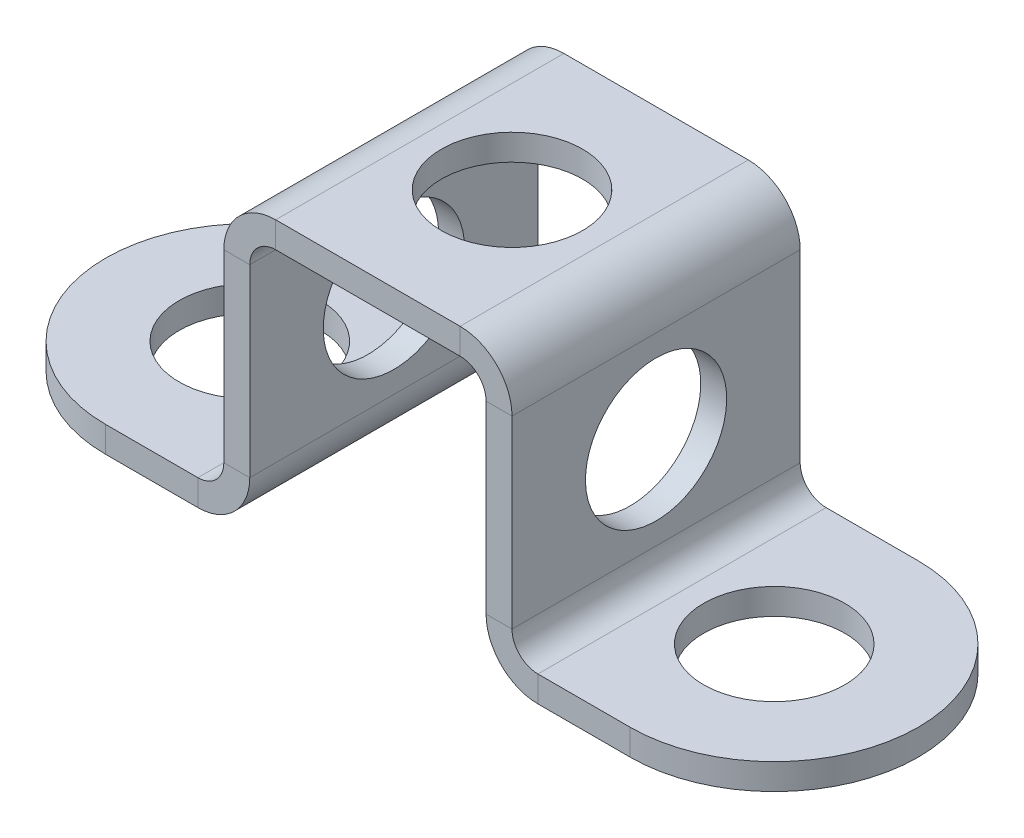
ISO-10303-21;
HEADER;
FILE_DESCRIPTION(('STEP AP214'),'2;1');
FILE_NAME('part.step','',(''),(''),'','','');
FILE_SCHEMA(('AUTOMOTIVE_DESIGN { 1 0 10303 214 1 1 1 1 }'));
ENDSEC;
DATA;
#1=APPLICATION_CONTEXT('core data for automotive mechanical design processes');
#2=APPLICATION_PROTOCOL_DEFINITION('international standard','automotive_design',2000,#1);
#3=PRODUCT_CONTEXT('',#1,'mechanical');
#4=PRODUCT('Part','Part','',(#3));
#5=PRODUCT_RELATED_PRODUCT_CATEGORY('part','',(#4));
#6=PRODUCT_DEFINITION_FORMATION('','',#4);
#7=PRODUCT_DEFINITION_CONTEXT('part definition',#1,'design');
#8=PRODUCT_DEFINITION('design','',#6,#7);
#9=PRODUCT_DEFINITION_SHAPE('','',#8);
#10=(LENGTH_UNIT() NAMED_UNIT(*) SI_UNIT(.MILLI.,.METRE.));
#11=(NAMED_UNIT(*) PLANE_ANGLE_UNIT() SI_UNIT($,.RADIAN.));
#12=(NAMED_UNIT(*) SI_UNIT($,.STERADIAN.) SOLID_ANGLE_UNIT());
#13=UNCERTAINTY_MEASURE_WITH_UNIT(LENGTH_MEASURE(1.E-05),#10,'distance_accuracy_value','');
#14=(GEOMETRIC_REPRESENTATION_CONTEXT(3) GLOBAL_UNCERTAINTY_ASSIGNED_CONTEXT((#13)) GLOBAL_UNIT_ASSIGNED_CONTEXT((#10,
#11,#12)) REPRESENTATION_CONTEXT('',''));
#15=CARTESIAN_POINT('',(0.,0.,0.));
#16=DIRECTION('',(0.,0.,1.));
#17=DIRECTION('',(1.,0.,0.));
#18=AXIS2_PLACEMENT_3D('',#15,#16,#17);
#19=CARTESIAN_POINT('',(0.,-10.,0.));
#20=DIRECTION('',(0.,1.,0.));
#21=DIRECTION('',(0.,0.,1.));
#22=AXIS2_PLACEMENT_3D('',#19,#20,#21);
#23=PLANE('',#22);
#24=DIRECTION('',(-1.,0.,0.));
#25=VECTOR('',#24,1.);
#26=CARTESIAN_POINT('',(-9.10000000000003,-10.,0.));
#27=LINE('',#26,#25);
#28=CARTESIAN_POINT('',(-4.10000000000002,-10.,0.));
#29=VERTEX_POINT('',#28);
#30=CARTESIAN_POINT('',(-0.900000000000024,-10.,0.));
#31=VERTEX_POINT('',#30);
#32=EDGE_CURVE('E289',#29,#31,#27,.F.);
#33=ORIENTED_EDGE('',*,*,#32,.F.);
#34=CARTESIAN_POINT('',(-4.10000000000003,-10.,-5.));
#35=DIRECTION('',(0.,-1.,0.));
#36=DIRECTION('',(0.,0.,1.));
#37=AXIS2_PLACEMENT_3D('',#34,#35,#36);
#38=CIRCLE('',#37,5.);
#39=CARTESIAN_POINT('',(-4.10000000000003,-10.,-10.));
#40=VERTEX_POINT('',#39);
#41=EDGE_CURVE('E271',#29,#40,#38,.T.);
#42=ORIENTED_EDGE('',*,*,#41,.T.);
#43=DIRECTION('',(1.,0.,0.));
#44=VECTOR('',#43,1.);
#45=CARTESIAN_POINT('',(0.,-10.,-10.));
#46=LINE('',#45,#44);
#47=CARTESIAN_POINT('',(-0.900000000000024,-10.,-9.99999999999999));
#48=VERTEX_POINT('',#47);
#49=EDGE_CURVE('E286',#48,#40,#46,.F.);
#50=ORIENTED_EDGE('',*,*,#49,.F.);
#51=DIRECTION('',(0.,0.,1.));
#52=VECTOR('',#51,1.);
#53=CARTESIAN_POINT('',(-0.900000000000024,-10.,-10.));
#54=LINE('',#53,#52);
#55=EDGE_CURVE('E291',#31,#48,#54,.F.);
#56=ORIENTED_EDGE('',*,*,#55,.F.);
#57=EDGE_LOOP('',(#33,#42,#50,#56));
#58=FACE_BOUND('',#57,.T.);
#59=CARTESIAN_POINT('',(-4.10000000000003,-10.,-5.));
#60=DIRECTION('',(0.,1.,0.));
#61=DIRECTION('',(0.,0.,-1.));
#62=AXIS2_PLACEMENT_3D('',#59,#60,#61);
#63=CIRCLE('',#62,2.45);
#64=CARTESIAN_POINT('',(-4.10000000000003,-10.,-7.45));
#65=VERTEX_POINT('',#64);
#66=EDGE_CURVE('E270',#65,#65,#63,.T.);
#67=ORIENTED_EDGE('',*,*,#66,.T.);
#68=EDGE_LOOP('',(#67));
#69=FACE_BOUND('',#68,.T.);
#70=ADVANCED_FACE('F120',(#58,#69),#23,.F.);
#71=CARTESIAN_POINT('',(0.,-9.1,0.));
#72=DIRECTION('',(0.,1.,0.));
#73=DIRECTION('',(0.,0.,1.));
#74=AXIS2_PLACEMENT_3D('',#71,#72,#73);
#75=PLANE('',#74);
#76=CARTESIAN_POINT('',(-4.10000000000003,-9.1,-5.));
#77=DIRECTION('',(0.,-1.,0.));
#78=DIRECTION('',(0.,0.,1.));
#79=AXIS2_PLACEMENT_3D('',#76,#77,#78);
#80=CIRCLE('',#79,5.);
#81=CARTESIAN_POINT('',(-4.10000000000002,-9.1,0.));
#82=VERTEX_POINT('',#81);
#83=CARTESIAN_POINT('',(-4.10000000000003,-9.1,-10.));
#84=VERTEX_POINT('',#83);
#85=EDGE_CURVE('E258',#82,#84,#80,.T.);
#86=ORIENTED_EDGE('',*,*,#85,.F.);
#87=DIRECTION('',(1.,0.,0.));
#88=VECTOR('',#87,1.);
#89=CARTESIAN_POINT('',(0.,-9.1,0.));
#90=LINE('',#89,#88);
#91=CARTESIAN_POINT('',(-0.900000000000024,-9.1,0.));
#92=VERTEX_POINT('',#91);
#93=EDGE_CURVE('E264',#82,#92,#90,.T.);
#94=ORIENTED_EDGE('',*,*,#93,.T.);
#95=DIRECTION('',(0.,0.,1.));
#96=VECTOR('',#95,1.);
#97=CARTESIAN_POINT('',(-0.900000000000024,-9.1,-10.));
#98=LINE('',#97,#96);
#99=CARTESIAN_POINT('',(-0.900000000000024,-9.1,-9.99999999999999));
#100=VERTEX_POINT('',#99);
#101=EDGE_CURVE('E297',#100,#92,#98,.T.);
#102=ORIENTED_EDGE('',*,*,#101,.F.);
#103=DIRECTION('',(-1.,0.,0.));
#104=VECTOR('',#103,1.);
#105=CARTESIAN_POINT('',(0.,-9.1,-10.));
#106=LINE('',#105,#104);
#107=EDGE_CURVE('E267',#100,#84,#106,.T.);
#108=ORIENTED_EDGE('',*,*,#107,.T.);
#109=EDGE_LOOP('',(#86,#94,#102,#108));
#110=FACE_BOUND('',#109,.T.);
#111=CARTESIAN_POINT('',(-4.10000000000003,-9.1,-5.));
#112=DIRECTION('',(0.,1.,0.));
#113=DIRECTION('',(0.,0.,-1.));
#114=AXIS2_PLACEMENT_3D('',#111,#112,#113);
#115=CIRCLE('',#114,2.45);
#116=CARTESIAN_POINT('',(-4.10000000000003,-9.1,-7.45));
#117=VERTEX_POINT('',#116);
#118=EDGE_CURVE('E1121',#117,#117,#115,.T.);
#119=ORIENTED_EDGE('',*,*,#118,.F.);
#120=EDGE_LOOP('',(#119));
#121=FACE_BOUND('',#120,.T.);
#122=ADVANCED_FACE('F260',(#110,#121),#75,.T.);
#123=CARTESIAN_POINT('',(0.,-0.899999999999997,0.));
#124=DIRECTION('',(0.,0.,1.));
#125=DIRECTION('',(1.,0.,0.));
#126=AXIS2_PLACEMENT_3D('',#123,#124,#125);
#127=PLANE('',#126);
#128=DIRECTION('',(0.,1.,0.));
#129=VECTOR('',#128,1.);
#130=CARTESIAN_POINT('',(0.,-0.899999999999997,0.));
#131=LINE('',#130,#129);
#132=CARTESIAN_POINT('',(0.,-1.79999999999999,0.));
#133=VERTEX_POINT('',#132);
#134=CARTESIAN_POINT('',(0.,-8.2,0.));
#135=VERTEX_POINT('',#134);
#136=EDGE_CURVE('E371',#133,#135,#131,.F.);
#137=ORIENTED_EDGE('',*,*,#136,.T.);
#138=DIRECTION('',(1.,0.,0.));
#139=VECTOR('',#138,1.);
#140=CARTESIAN_POINT('',(0.,-8.2,0.));
#141=LINE('',#140,#139);
#142=CARTESIAN_POINT('',(0.899999999999975,-8.20000000000001,0.));
#143=VERTEX_POINT('',#142);
#144=EDGE_CURVE('E308',#135,#143,#141,.T.);
#145=ORIENTED_EDGE('',*,*,#144,.T.);
#146=DIRECTION('',(0.,-1.,0.));
#147=VECTOR('',#146,1.);
#148=CARTESIAN_POINT('',(0.900000000000003,0.,0.));
#149=LINE('',#148,#147);
#150=CARTESIAN_POINT('',(0.899999999999997,-1.8,0.));
#151=VERTEX_POINT('',#150);
#152=EDGE_CURVE('E376',#151,#143,#149,.T.);
#153=ORIENTED_EDGE('',*,*,#152,.F.);
#154=DIRECTION('',(-1.,0.,0.));
#155=VECTOR('',#154,1.);
#156=CARTESIAN_POINT('',(0.,-1.79999999999999,0.));
#157=LINE('',#156,#155);
#158=EDGE_CURVE('E366',#151,#133,#157,.T.);
#159=ORIENTED_EDGE('',*,*,#158,.T.);
#160=EDGE_LOOP('',(#137,#145,#153,#159));
#161=FACE_BOUND('',#160,.T.);
#162=ADVANCED_FACE('F496',(#161),#127,.T.);
#163=CARTESIAN_POINT('',(0.,0.,0.));
#164=DIRECTION('',(1.,0.,0.));
#165=DIRECTION('',(0.,1.,0.));
#166=AXIS2_PLACEMENT_3D('',#163,#164,#165);
#167=PLANE('',#166);
#168=CARTESIAN_POINT('',(0.,-5.00000000000003,-5.));
#169=DIRECTION('',(1.,0.,0.));
#170=DIRECTION('',(0.,1.,0.));
#171=AXIS2_PLACEMENT_3D('',#168,#169,#170);
#172=CIRCLE('',#171,2.45);
#173=CARTESIAN_POINT('',(0.,-2.55000000000003,-5.));
#174=VERTEX_POINT('',#173);
#175=EDGE_CURVE('E302',#174,#174,#172,.T.);
#176=ORIENTED_EDGE('',*,*,#175,.T.);
#177=EDGE_LOOP('',(#176));
#178=FACE_BOUND('',#177,.T.);
#179=DIRECTION('',(0.,0.,1.));
#180=VECTOR('',#179,1.);
#181=CARTESIAN_POINT('',(0.,-8.2,0.));
#182=LINE('',#181,#180);
#183=CARTESIAN_POINT('',(0.,-8.2,-9.99999999999999));
#184=VERTEX_POINT('',#183);
#185=EDGE_CURVE('E314',#135,#184,#182,.F.);
#186=ORIENTED_EDGE('',*,*,#185,.F.);
#187=ORIENTED_EDGE('',*,*,#136,.F.);
#188=DIRECTION('',(0.,0.,-1.));
#189=VECTOR('',#188,1.);
#190=CARTESIAN_POINT('',(0.,-1.79999999999999,0.));
#191=LINE('',#190,#189);
#192=CARTESIAN_POINT('',(0.,-1.79999999999999,-10.));
#193=VERTEX_POINT('',#192);
#194=EDGE_CURVE('E379',#193,#133,#191,.F.);
#195=ORIENTED_EDGE('',*,*,#194,.F.);
#196=DIRECTION('',(0.,-1.,0.));
#197=VECTOR('',#196,1.);
#198=CARTESIAN_POINT('',(0.,-10.,-10.));
#199=LINE('',#198,#197);
#200=EDGE_CURVE('E368',#184,#193,#199,.F.);
#201=ORIENTED_EDGE('',*,*,#200,.F.);
#202=EDGE_LOOP('',(#186,#187,#195,#201));
#203=FACE_BOUND('',#202,.T.);
#204=ADVANCED_FACE('F490',(#178,#203),#167,.F.);
#205=CARTESIAN_POINT('',(0.900000000000003,0.,0.));
#206=DIRECTION('',(1.,0.,0.));
#207=DIRECTION('',(0.,1.,0.));
#208=AXIS2_PLACEMENT_3D('',#205,#206,#207);
#209=PLANE('',#208);
#210=CARTESIAN_POINT('',(0.899999999999986,-5.00000000000003,-5.));
#211=DIRECTION('',(1.,0.,0.));
#212=DIRECTION('',(0.,1.,0.));
#213=AXIS2_PLACEMENT_3D('',#210,#211,#212);
#214=CIRCLE('',#213,2.45);
#215=CARTESIAN_POINT('',(0.899999999999994,-2.55000000000003,-5.));
#216=VERTEX_POINT('',#215);
#217=EDGE_CURVE('E1140',#216,#216,#214,.T.);
#218=ORIENTED_EDGE('',*,*,#217,.F.);
#219=EDGE_LOOP('',(#218));
#220=FACE_BOUND('',#219,.T.);
#221=ORIENTED_EDGE('',*,*,#152,.T.);
#222=DIRECTION('',(0.,0.,1.));
#223=VECTOR('',#222,1.);
#224=CARTESIAN_POINT('',(0.899999999999975,-8.20000000000001,0.));
#225=LINE('',#224,#223);
#226=CARTESIAN_POINT('',(0.899999999999974,-8.2,-10.));
#227=VERTEX_POINT('',#226);
#228=EDGE_CURVE('E303',#143,#227,#225,.F.);
#229=ORIENTED_EDGE('',*,*,#228,.T.);
#230=DIRECTION('',(0.,1.,0.));
#231=VECTOR('',#230,1.);
#232=CARTESIAN_POINT('',(0.900000000000003,0.,-10.));
#233=LINE('',#232,#231);
#234=CARTESIAN_POINT('',(0.899999999999997,-1.8,-10.));
#235=VERTEX_POINT('',#234);
#236=EDGE_CURVE('E374',#227,#235,#233,.T.);
#237=ORIENTED_EDGE('',*,*,#236,.T.);
#238=DIRECTION('',(0.,0.,-1.));
#239=VECTOR('',#238,1.);
#240=CARTESIAN_POINT('',(0.899999999999997,-1.8,0.));
#241=LINE('',#240,#239);
#242=EDGE_CURVE('E384',#151,#235,#241,.T.);
#243=ORIENTED_EDGE('',*,*,#242,.F.);
#244=EDGE_LOOP('',(#221,#229,#237,#243));
#245=FACE_BOUND('',#244,.T.);
#246=ADVANCED_FACE('F499',(#220,#245),#209,.T.);
#247=CARTESIAN_POINT('',(10.,-10.,-10.));
#248=DIRECTION('',(0.,0.,-1.));
#249=DIRECTION('',(-1.,0.,0.));
#250=AXIS2_PLACEMENT_3D('',#247,#248,#249);
#251=PLANE('',#250);
#252=DIRECTION('',(0.,-1.,0.));
#253=VECTOR('',#252,1.);
#254=CARTESIAN_POINT('',(10.,-10.,-10.));
#255=LINE('',#254,#253);
#256=CARTESIAN_POINT('',(10.,-1.79999999999999,-9.99999999999999));
#257=VERTEX_POINT('',#256);
#258=CARTESIAN_POINT('',(10.,-8.2,-10.));
#259=VERTEX_POINT('',#258);
#260=EDGE_CURVE('E415',#257,#259,#255,.T.);
#261=ORIENTED_EDGE('',*,*,#260,.T.);
#262=DIRECTION('',(-1.,0.,0.));
#263=VECTOR('',#262,1.);
#264=CARTESIAN_POINT('',(10.,-8.2,-10.));
#265=LINE('',#264,#263);
#266=CARTESIAN_POINT('',(9.10000000000002,-8.20000000000001,-10.));
#267=VERTEX_POINT('',#266);
#268=EDGE_CURVE('E352',#259,#267,#265,.T.);
#269=ORIENTED_EDGE('',*,*,#268,.T.);
#270=DIRECTION('',(0.,1.,0.));
#271=VECTOR('',#270,1.);
#272=CARTESIAN_POINT('',(9.1,0.,-10.));
#273=LINE('',#272,#271);
#274=CARTESIAN_POINT('',(9.1,-1.8,-9.99999999999999));
#275=VERTEX_POINT('',#274);
#276=EDGE_CURVE('E420',#275,#267,#273,.F.);
#277=ORIENTED_EDGE('',*,*,#276,.F.);
#278=DIRECTION('',(1.,0.,0.));
#279=VECTOR('',#278,1.);
#280=CARTESIAN_POINT('',(10.,-1.79999999999999,-10.));
#281=LINE('',#280,#279);
#282=EDGE_CURVE('E409',#275,#257,#281,.T.);
#283=ORIENTED_EDGE('',*,*,#282,.T.);
#284=EDGE_LOOP('',(#261,#269,#277,#283));
#285=FACE_BOUND('',#284,.T.);
#286=ADVANCED_FACE('F527',(#285),#251,.T.);
#287=CARTESIAN_POINT('',(10.,0.,0.));
#288=DIRECTION('',(1.,0.,0.));
#289=DIRECTION('',(0.,1.,0.));
#290=AXIS2_PLACEMENT_3D('',#287,#288,#289);
#291=PLANE('',#290);
#292=CARTESIAN_POINT('',(10.,-5.,-5.));
#293=DIRECTION('',(1.,0.,0.));
#294=DIRECTION('',(0.,1.,0.));
#295=AXIS2_PLACEMENT_3D('',#292,#293,#294);
#296=CIRCLE('',#295,2.45);
#297=CARTESIAN_POINT('',(10.,-2.55,-5.));
#298=VERTEX_POINT('',#297);
#299=EDGE_CURVE('E1135',#298,#298,#296,.T.);
#300=ORIENTED_EDGE('',*,*,#299,.F.);
#301=EDGE_LOOP('',(#300));
#302=FACE_BOUND('',#301,.T.);
#303=DIRECTION('',(0.,1.,0.));
#304=VECTOR('',#303,1.);
#305=CARTESIAN_POINT('',(10.,-0.899999999999997,0.));
#306=LINE('',#305,#304);
#307=CARTESIAN_POINT('',(10.,-8.2,0.));
#308=VERTEX_POINT('',#307);
#309=CARTESIAN_POINT('',(10.,-1.79999999999999,0.));
#310=VERTEX_POINT('',#309);
#311=EDGE_CURVE('E412',#308,#310,#306,.T.);
#312=ORIENTED_EDGE('',*,*,#311,.F.);
#313=DIRECTION('',(0.,0.,-1.));
#314=VECTOR('',#313,1.);
#315=CARTESIAN_POINT('',(10.,-8.2,-10.));
#316=LINE('',#315,#314);
#317=EDGE_CURVE('E358',#259,#308,#316,.F.);
#318=ORIENTED_EDGE('',*,*,#317,.F.);
#319=ORIENTED_EDGE('',*,*,#260,.F.);
#320=DIRECTION('',(0.,0.,1.));
#321=VECTOR('',#320,1.);
#322=CARTESIAN_POINT('',(10.,-1.79999999999999,0.));
#323=LINE('',#322,#321);
#324=EDGE_CURVE('E423',#257,#310,#323,.T.);
#325=ORIENTED_EDGE('',*,*,#324,.T.);
#326=EDGE_LOOP('',(#312,#318,#319,#325));
#327=FACE_BOUND('',#326,.T.);
#328=ADVANCED_FACE('F521',(#302,#327),#291,.T.);
#329=CARTESIAN_POINT('',(9.1,0.,0.));
#330=DIRECTION('',(1.,0.,0.));
#331=DIRECTION('',(0.,1.,0.));
#332=AXIS2_PLACEMENT_3D('',#329,#330,#331);
#333=PLANE('',#332);
#334=CARTESIAN_POINT('',(9.10000000000001,-5.,-5.));
#335=DIRECTION('',(1.,0.,0.));
#336=DIRECTION('',(0.,1.,0.));
#337=AXIS2_PLACEMENT_3D('',#334,#335,#336);
#338=CIRCLE('',#337,2.45);
#339=CARTESIAN_POINT('',(9.1,-2.55,-5.));
#340=VERTEX_POINT('',#339);
#341=EDGE_CURVE('E124',#340,#340,#338,.T.);
#342=ORIENTED_EDGE('',*,*,#341,.T.);
#343=EDGE_LOOP('',(#342));
#344=FACE_BOUND('',#343,.T.);
#345=DIRECTION('',(0.,0.,-1.));
#346=VECTOR('',#345,1.);
#347=CARTESIAN_POINT('',(9.10000000000002,-8.20000000000001,-10.));
#348=LINE('',#347,#346);
#349=CARTESIAN_POINT('',(9.10000000000002,-8.2,0.));
#350=VERTEX_POINT('',#349);
#351=EDGE_CURVE('E346',#267,#350,#348,.F.);
#352=ORIENTED_EDGE('',*,*,#351,.T.);
#353=DIRECTION('',(0.,-1.,0.));
#354=VECTOR('',#353,1.);
#355=CARTESIAN_POINT('',(9.1,0.,0.));
#356=LINE('',#355,#354);
#357=CARTESIAN_POINT('',(9.1,-1.8,0.));
#358=VERTEX_POINT('',#357);
#359=EDGE_CURVE('E418',#350,#358,#356,.F.);
#360=ORIENTED_EDGE('',*,*,#359,.T.);
#361=DIRECTION('',(0.,0.,-1.));
#362=VECTOR('',#361,1.);
#363=CARTESIAN_POINT('',(9.1,-1.8,-10.));
#364=LINE('',#363,#362);
#365=EDGE_CURVE('E429',#275,#358,#364,.F.);
#366=ORIENTED_EDGE('',*,*,#365,.F.);
#367=ORIENTED_EDGE('',*,*,#276,.T.);
#368=EDGE_LOOP('',(#352,#360,#366,#367));
#369=FACE_BOUND('',#368,.T.);
#370=ADVANCED_FACE('F532',(#344,#369),#333,.F.);
#371=CARTESIAN_POINT('',(0.,-0.9,0.));
#372=DIRECTION('',(0.,-1.,0.));
#373=DIRECTION('',(0.,0.,-1.));
#374=AXIS2_PLACEMENT_3D('',#371,#372,#373);
#375=PLANE('',#374);
#376=CARTESIAN_POINT('',(5.,-0.9,-5.));
#377=DIRECTION('',(0.,1.,0.));
#378=DIRECTION('',(0.,0.,1.));
#379=AXIS2_PLACEMENT_3D('',#376,#377,#378);
#380=CIRCLE('',#379,2.45);
#381=CARTESIAN_POINT('',(5.,-0.9,-2.55));
#382=VERTEX_POINT('',#381);
#383=EDGE_CURVE('E456',#382,#382,#380,.T.);
#384=ORIENTED_EDGE('',*,*,#383,.T.);
#385=EDGE_LOOP('',(#384));
#386=FACE_BOUND('',#385,.T.);
#387=DIRECTION('',(1.,0.,0.));
#388=VECTOR('',#387,1.);
#389=CARTESIAN_POINT('',(0.,-0.9,0.));
#390=LINE('',#389,#388);
#391=CARTESIAN_POINT('',(1.8,-0.9,0.));
#392=VERTEX_POINT('',#391);
#393=CARTESIAN_POINT('',(8.2,-0.9,0.));
#394=VERTEX_POINT('',#393);
#395=EDGE_CURVE('E129',#392,#394,#390,.T.);
#396=ORIENTED_EDGE('',*,*,#395,.F.);
#397=DIRECTION('',(0.,0.,-1.));
#398=VECTOR('',#397,1.);
#399=CARTESIAN_POINT('',(1.8,-0.9,-10.));
#400=LINE('',#399,#398);
#401=CARTESIAN_POINT('',(1.8,-0.9,-10.));
#402=VERTEX_POINT('',#401);
#403=EDGE_CURVE('E401',#402,#392,#400,.F.);
#404=ORIENTED_EDGE('',*,*,#403,.F.);
#405=DIRECTION('',(-1.,0.,0.));
#406=VECTOR('',#405,1.);
#407=CARTESIAN_POINT('',(0.,-0.9,-10.));
#408=LINE('',#407,#406);
#409=CARTESIAN_POINT('',(8.2,-0.9,-10.));
#410=VERTEX_POINT('',#409);
#411=EDGE_CURVE('E13',#410,#402,#408,.T.);
#412=ORIENTED_EDGE('',*,*,#411,.F.);
#413=DIRECTION('',(0.,0.,1.));
#414=VECTOR('',#413,1.);
#415=CARTESIAN_POINT('',(8.2,-0.899999999999999,0.));
#416=LINE('',#415,#414);
#417=EDGE_CURVE('E446',#394,#410,#416,.F.);
#418=ORIENTED_EDGE('',*,*,#417,.F.);
#419=EDGE_LOOP('',(#396,#404,#412,#418));
#420=FACE_BOUND('',#419,.T.);
#421=ADVANCED_FACE('F504',(#386,#420),#375,.T.);
#422=CARTESIAN_POINT('',(0.,0.,0.));
#423=DIRECTION('',(0.,-1.,0.));
#424=DIRECTION('',(0.,0.,-1.));
#425=AXIS2_PLACEMENT_3D('',#422,#423,#424);
#426=PLANE('',#425);
#427=CARTESIAN_POINT('',(5.,0.,-5.));
#428=DIRECTION('',(0.,1.,0.));
#429=DIRECTION('',(0.,0.,1.));
#430=AXIS2_PLACEMENT_3D('',#427,#428,#429);
#431=CIRCLE('',#430,2.45);
#432=CARTESIAN_POINT('',(5.,0.,-2.55));
#433=VERTEX_POINT('',#432);
#434=EDGE_CURVE('E454',#433,#433,#431,.T.);
#435=ORIENTED_EDGE('',*,*,#434,.F.);
#436=EDGE_LOOP('',(#435));
#437=FACE_BOUND('',#436,.T.);
#438=DIRECTION('',(0.,0.,-1.));
#439=VECTOR('',#438,1.);
#440=CARTESIAN_POINT('',(1.8,0.,-10.));
#441=LINE('',#440,#439);
#442=CARTESIAN_POINT('',(1.8,0.,-10.));
#443=VERTEX_POINT('',#442);
#444=CARTESIAN_POINT('',(1.8,0.,0.));
#445=VERTEX_POINT('',#444);
#446=EDGE_CURVE('E389',#443,#445,#441,.F.);
#447=ORIENTED_EDGE('',*,*,#446,.T.);
#448=DIRECTION('',(1.,0.,0.));
#449=VECTOR('',#448,1.);
#450=CARTESIAN_POINT('',(0.,0.,0.));
#451=LINE('',#450,#449);
#452=CARTESIAN_POINT('',(8.2,0.,0.));
#453=VERTEX_POINT('',#452);
#454=EDGE_CURVE('E459',#445,#453,#451,.T.);
#455=ORIENTED_EDGE('',*,*,#454,.T.);
#456=DIRECTION('',(0.,0.,1.));
#457=VECTOR('',#456,1.);
#458=CARTESIAN_POINT('',(8.2,0.,0.));
#459=LINE('',#458,#457);
#460=CARTESIAN_POINT('',(8.2,0.,-10.));
#461=VERTEX_POINT('',#460);
#462=EDGE_CURVE('E434',#453,#461,#459,.F.);
#463=ORIENTED_EDGE('',*,*,#462,.T.);
#464=DIRECTION('',(-1.,0.,0.));
#465=VECTOR('',#464,1.);
#466=CARTESIAN_POINT('',(0.,0.,-10.));
#467=LINE('',#466,#465);
#468=EDGE_CURVE('E462',#461,#443,#467,.T.);
#469=ORIENTED_EDGE('',*,*,#468,.T.);
#470=EDGE_LOOP('',(#447,#455,#463,#469));
#471=FACE_BOUND('',#470,.T.);
#472=ADVANCED_FACE('F467',(#437,#471),#426,.F.);
#473=CARTESIAN_POINT('',(0.,-0.9,-10.));
#474=DIRECTION('',(0.,0.,-1.));
#475=DIRECTION('',(-1.,0.,0.));
#476=AXIS2_PLACEMENT_3D('',#473,#474,#475);
#477=PLANE('',#476);
#478=ORIENTED_EDGE('',*,*,#411,.T.);
#479=DIRECTION('',(0.,1.,0.));
#480=VECTOR('',#479,1.);
#481=CARTESIAN_POINT('',(1.8,-0.9,-10.));
#482=LINE('',#481,#480);
#483=EDGE_CURVE('E395',#402,#443,#482,.T.);
#484=ORIENTED_EDGE('',*,*,#483,.T.);
#485=ORIENTED_EDGE('',*,*,#468,.F.);
#486=DIRECTION('',(0.,1.,0.));
#487=VECTOR('',#486,1.);
#488=CARTESIAN_POINT('',(8.2,-0.899999999999999,-9.99999999999999));
#489=LINE('',#488,#487);
#490=EDGE_CURVE('E451',#410,#461,#489,.T.);
#491=ORIENTED_EDGE('',*,*,#490,.F.);
#492=EDGE_LOOP('',(#478,#484,#485,#491));
#493=FACE_BOUND('',#492,.T.);
#494=ADVANCED_FACE('F473',(#493),#477,.T.);
#495=CARTESIAN_POINT('',(0.,-0.9,0.));
#496=DIRECTION('',(0.,0.,1.));
#497=DIRECTION('',(1.,0.,0.));
#498=AXIS2_PLACEMENT_3D('',#495,#496,#497);
#499=PLANE('',#498);
#500=DIRECTION('',(0.,1.,0.));
#501=VECTOR('',#500,1.);
#502=CARTESIAN_POINT('',(1.8,-0.9,0.));
#503=LINE('',#502,#501);
#504=EDGE_CURVE('E406',#392,#445,#503,.T.);
#505=ORIENTED_EDGE('',*,*,#504,.F.);
#506=ORIENTED_EDGE('',*,*,#395,.T.);
#507=DIRECTION('',(0.,1.,0.));
#508=VECTOR('',#507,1.);
#509=CARTESIAN_POINT('',(8.2,-0.899999999999999,0.));
#510=LINE('',#509,#508);
#511=EDGE_CURVE('E440',#394,#453,#510,.T.);
#512=ORIENTED_EDGE('',*,*,#511,.T.);
#513=ORIENTED_EDGE('',*,*,#454,.F.);
#514=EDGE_LOOP('',(#505,#506,#512,#513));
#515=FACE_BOUND('',#514,.T.);
#516=ADVANCED_FACE('F122',(#515),#499,.T.);
#517=CARTESIAN_POINT('',(5.,-0.9,-5.));
#518=DIRECTION('',(0.,1.,0.));
#519=DIRECTION('',(0.,0.,1.));
#520=AXIS2_PLACEMENT_3D('',#517,#518,#519);
#521=CYLINDRICAL_SURFACE('',#520,2.45);
#522=ORIENTED_EDGE('',*,*,#383,.F.);
#523=EDGE_LOOP('',(#522));
#524=FACE_BOUND('',#523,.T.);
#525=ORIENTED_EDGE('',*,*,#434,.T.);
#526=EDGE_LOOP('',(#525));
#527=FACE_BOUND('',#526,.T.);
#528=ADVANCED_FACE('F980',(#524,#527),#521,.F.);
#529=CARTESIAN_POINT('',(8.2,-1.8,-10.));
#530=DIRECTION('',(0.,0.,-1.));
#531=DIRECTION('',(-1.,0.,0.));
#532=AXIS2_PLACEMENT_3D('',#529,#530,#531);
#533=PLANE('',#532);
#534=ORIENTED_EDGE('',*,*,#282,.F.);
#535=CARTESIAN_POINT('',(8.2,-1.8,-10.));
#536=DIRECTION('',(0.,0.,1.));
#537=DIRECTION('',(1.,0.,0.));
#538=AXIS2_PLACEMENT_3D('',#535,#536,#537);
#539=CIRCLE('',#538,0.9);
#540=EDGE_CURVE('E443',#410,#275,#539,.F.);
#541=ORIENTED_EDGE('',*,*,#540,.F.);
#542=ORIENTED_EDGE('',*,*,#490,.T.);
#543=CARTESIAN_POINT('',(8.2,-1.8,-9.99999999999999));
#544=DIRECTION('',(0.,0.,1.));
#545=DIRECTION('',(1.,0.,0.));
#546=AXIS2_PLACEMENT_3D('',#543,#544,#545);
#547=CIRCLE('',#546,1.8);
#548=EDGE_CURVE('E436',#461,#257,#547,.F.);
#549=ORIENTED_EDGE('',*,*,#548,.T.);
#550=EDGE_LOOP('',(#534,#541,#542,#549));
#551=FACE_BOUND('',#550,.T.);
#552=ADVANCED_FACE('F523',(#551),#533,.T.);
#553=CARTESIAN_POINT('',(8.2,-1.8,0.));
#554=DIRECTION('',(0.,0.,-1.));
#555=DIRECTION('',(-1.,0.,0.));
#556=AXIS2_PLACEMENT_3D('',#553,#554,#555);
#557=PLANE('',#556);
#558=CARTESIAN_POINT('',(8.2,-1.8,0.));
#559=DIRECTION('',(0.,0.,1.));
#560=DIRECTION('',(1.,0.,0.));
#561=AXIS2_PLACEMENT_3D('',#558,#559,#560);
#562=CIRCLE('',#561,0.9);
#563=EDGE_CURVE('E414',#358,#394,#562,.T.);
#564=ORIENTED_EDGE('',*,*,#563,.F.);
#565=DIRECTION('',(1.,0.,0.));
#566=VECTOR('',#565,1.);
#567=CARTESIAN_POINT('',(9.1,-1.8,0.));
#568=LINE('',#567,#566);
#569=EDGE_CURVE('E426',#358,#310,#568,.T.);
#570=ORIENTED_EDGE('',*,*,#569,.T.);
#571=CARTESIAN_POINT('',(8.2,-1.8,0.));
#572=DIRECTION('',(0.,0.,1.));
#573=DIRECTION('',(1.,0.,0.));
#574=AXIS2_PLACEMENT_3D('',#571,#572,#573);
#575=CIRCLE('',#574,1.8);
#576=EDGE_CURVE('E437',#310,#453,#575,.T.);
#577=ORIENTED_EDGE('',*,*,#576,.T.);
#578=ORIENTED_EDGE('',*,*,#511,.F.);
#579=EDGE_LOOP('',(#564,#570,#577,#578));
#580=FACE_BOUND('',#579,.T.);
#581=ADVANCED_FACE('F514',(#580),#557,.F.);
#582=CARTESIAN_POINT('',(8.2,-1.8,0.));
#583=DIRECTION('',(0.,0.,1.));
#584=DIRECTION('',(1.,0.,0.));
#585=AXIS2_PLACEMENT_3D('',#582,#583,#584);
#586=CYLINDRICAL_SURFACE('',#585,1.8);
#587=ORIENTED_EDGE('',*,*,#462,.F.);
#588=ORIENTED_EDGE('',*,*,#576,.F.);
#589=ORIENTED_EDGE('',*,*,#324,.F.);
#590=ORIENTED_EDGE('',*,*,#548,.F.);
#591=EDGE_LOOP('',(#587,#588,#589,#590));
#592=FACE_BOUND('',#591,.T.);
#593=ADVANCED_FACE('F511',(#592),#586,.T.);
#594=CARTESIAN_POINT('',(8.2,-1.8,0.));
#595=DIRECTION('',(0.,0.,1.));
#596=DIRECTION('',(1.,0.,0.));
#597=AXIS2_PLACEMENT_3D('',#594,#595,#596);
#598=CYLINDRICAL_SURFACE('',#597,0.9);
#599=ORIENTED_EDGE('',*,*,#417,.T.);
#600=ORIENTED_EDGE('',*,*,#540,.T.);
#601=ORIENTED_EDGE('',*,*,#365,.T.);
#602=ORIENTED_EDGE('',*,*,#563,.T.);
#603=EDGE_LOOP('',(#599,#600,#601,#602));
#604=FACE_BOUND('',#603,.T.);
#605=ADVANCED_FACE('F938',(#604),#598,.F.);
#606=CARTESIAN_POINT('',(10.,-0.899999999999997,0.));
#607=DIRECTION('',(0.,0.,1.));
#608=DIRECTION('',(1.,0.,0.));
#609=AXIS2_PLACEMENT_3D('',#606,#607,#608);
#610=PLANE('',#609);
#611=DIRECTION('',(-1.,0.,0.));
#612=VECTOR('',#611,1.);
#613=CARTESIAN_POINT('',(10.,-8.2,0.));
#614=LINE('',#613,#612);
#615=EDGE_CURVE('E363',#308,#350,#614,.T.);
#616=ORIENTED_EDGE('',*,*,#615,.F.);
#617=ORIENTED_EDGE('',*,*,#311,.T.);
#618=ORIENTED_EDGE('',*,*,#569,.F.);
#619=ORIENTED_EDGE('',*,*,#359,.F.);
#620=EDGE_LOOP('',(#616,#617,#618,#619));
#621=FACE_BOUND('',#620,.T.);
#622=ADVANCED_FACE('F927',(#621),#610,.T.);
#623=CARTESIAN_POINT('',(1.8,-1.8,0.));
#624=DIRECTION('',(0.,0.,1.));
#625=DIRECTION('',(1.,0.,0.));
#626=AXIS2_PLACEMENT_3D('',#623,#624,#625);
#627=PLANE('',#626);
#628=ORIENTED_EDGE('',*,*,#158,.F.);
#629=CARTESIAN_POINT('',(1.8,-1.8,0.));
#630=DIRECTION('',(0.,0.,-1.));
#631=DIRECTION('',(-1.,0.,0.));
#632=AXIS2_PLACEMENT_3D('',#629,#630,#631);
#633=CIRCLE('',#632,0.9);
#634=EDGE_CURVE('E398',#392,#151,#633,.F.);
#635=ORIENTED_EDGE('',*,*,#634,.F.);
#636=ORIENTED_EDGE('',*,*,#504,.T.);
#637=CARTESIAN_POINT('',(1.8,-1.8,0.));
#638=DIRECTION('',(0.,0.,-1.));
#639=DIRECTION('',(-1.,0.,0.));
#640=AXIS2_PLACEMENT_3D('',#637,#638,#639);
#641=CIRCLE('',#640,1.8);
#642=EDGE_CURVE('E391',#445,#133,#641,.F.);
#643=ORIENTED_EDGE('',*,*,#642,.T.);
#644=EDGE_LOOP('',(#628,#635,#636,#643));
#645=FACE_BOUND('',#644,.T.);
#646=ADVANCED_FACE('F492',(#645),#627,.T.);
#647=CARTESIAN_POINT('',(1.8,-1.8,-10.));
#648=DIRECTION('',(0.,0.,1.));
#649=DIRECTION('',(1.,0.,0.));
#650=AXIS2_PLACEMENT_3D('',#647,#648,#649);
#651=PLANE('',#650);
#652=CARTESIAN_POINT('',(1.8,-1.8,-10.));
#653=DIRECTION('',(0.,0.,-1.));
#654=DIRECTION('',(-1.,0.,0.));
#655=AXIS2_PLACEMENT_3D('',#652,#653,#654);
#656=CIRCLE('',#655,0.9);
#657=EDGE_CURVE('E370',#235,#402,#656,.T.);
#658=ORIENTED_EDGE('',*,*,#657,.F.);
#659=DIRECTION('',(-1.,0.,0.));
#660=VECTOR('',#659,1.);
#661=CARTESIAN_POINT('',(0.899999999999997,-1.8,-10.));
#662=LINE('',#661,#660);
#663=EDGE_CURVE('E381',#235,#193,#662,.T.);
#664=ORIENTED_EDGE('',*,*,#663,.T.);
#665=CARTESIAN_POINT('',(1.8,-1.8,-10.));
#666=DIRECTION('',(0.,0.,-1.));
#667=DIRECTION('',(-1.,0.,0.));
#668=AXIS2_PLACEMENT_3D('',#665,#666,#667);
#669=CIRCLE('',#668,1.8);
#670=EDGE_CURVE('E392',#193,#443,#669,.T.);
#671=ORIENTED_EDGE('',*,*,#670,.T.);
#672=ORIENTED_EDGE('',*,*,#483,.F.);
#673=EDGE_LOOP('',(#658,#664,#671,#672));
#674=FACE_BOUND('',#673,.T.);
#675=ADVANCED_FACE('F481',(#674),#651,.F.);
#676=CARTESIAN_POINT('',(1.8,-1.8,-10.));
#677=DIRECTION('',(0.,0.,-1.));
#678=DIRECTION('',(-1.,0.,0.));
#679=AXIS2_PLACEMENT_3D('',#676,#677,#678);
#680=CYLINDRICAL_SURFACE('',#679,1.8);
#681=ORIENTED_EDGE('',*,*,#446,.F.);
#682=ORIENTED_EDGE('',*,*,#670,.F.);
#683=ORIENTED_EDGE('',*,*,#194,.T.);
#684=ORIENTED_EDGE('',*,*,#642,.F.);
#685=EDGE_LOOP('',(#681,#682,#683,#684));
#686=FACE_BOUND('',#685,.T.);
#687=ADVANCED_FACE('F480',(#686),#680,.T.);
#688=CARTESIAN_POINT('',(1.8,-1.8,-10.));
#689=DIRECTION('',(0.,0.,-1.));
#690=DIRECTION('',(-1.,0.,0.));
#691=AXIS2_PLACEMENT_3D('',#688,#689,#690);
#692=CYLINDRICAL_SURFACE('',#691,0.9);
#693=ORIENTED_EDGE('',*,*,#403,.T.);
#694=ORIENTED_EDGE('',*,*,#634,.T.);
#695=ORIENTED_EDGE('',*,*,#242,.T.);
#696=ORIENTED_EDGE('',*,*,#657,.T.);
#697=EDGE_LOOP('',(#693,#694,#695,#696));
#698=FACE_BOUND('',#697,.T.);
#699=ADVANCED_FACE('F501',(#698),#692,.F.);
#700=CARTESIAN_POINT('',(0.,-10.,-10.));
#701=DIRECTION('',(0.,0.,-1.));
#702=DIRECTION('',(-1.,0.,0.));
#703=AXIS2_PLACEMENT_3D('',#700,#701,#702);
#704=PLANE('',#703);
#705=DIRECTION('',(1.,0.,0.));
#706=VECTOR('',#705,1.);
#707=CARTESIAN_POINT('',(0.,-8.2,-9.99999999999999));
#708=LINE('',#707,#706);
#709=EDGE_CURVE('E319',#184,#227,#708,.T.);
#710=ORIENTED_EDGE('',*,*,#709,.F.);
#711=ORIENTED_EDGE('',*,*,#200,.T.);
#712=ORIENTED_EDGE('',*,*,#663,.F.);
#713=ORIENTED_EDGE('',*,*,#236,.F.);
#714=EDGE_LOOP('',(#710,#711,#712,#713));
#715=FACE_BOUND('',#714,.T.);
#716=ADVANCED_FACE('F823',(#715),#704,.T.);
#717=CARTESIAN_POINT('',(10.9,-8.2,0.));
#718=DIRECTION('',(0.,0.,1.));
#719=DIRECTION('',(1.,0.,0.));
#720=AXIS2_PLACEMENT_3D('',#717,#718,#719);
#721=PLANE('',#720);
#722=DIRECTION('',(0.,-1.,0.));
#723=VECTOR('',#722,1.);
#724=CARTESIAN_POINT('',(10.9,-10.,0.));
#725=LINE('',#724,#723);
#726=CARTESIAN_POINT('',(10.9,-9.1,0.));
#727=VERTEX_POINT('',#726);
#728=CARTESIAN_POINT('',(10.9,-10.,0.));
#729=VERTEX_POINT('',#728);
#730=EDGE_CURVE('E321',#727,#729,#725,.T.);
#731=ORIENTED_EDGE('',*,*,#730,.F.);
#732=CARTESIAN_POINT('',(10.9,-8.2,0.));
#733=DIRECTION('',(0.,0.,-1.));
#734=DIRECTION('',(-1.,0.,0.));
#735=AXIS2_PLACEMENT_3D('',#732,#733,#734);
#736=CIRCLE('',#735,0.9);
#737=EDGE_CURVE('E355',#308,#727,#736,.F.);
#738=ORIENTED_EDGE('',*,*,#737,.F.);
#739=ORIENTED_EDGE('',*,*,#615,.T.);
#740=CARTESIAN_POINT('',(10.9,-8.2,0.));
#741=DIRECTION('',(0.,0.,-1.));
#742=DIRECTION('',(-1.,0.,0.));
#743=AXIS2_PLACEMENT_3D('',#740,#741,#742);
#744=CIRCLE('',#743,1.8);
#745=EDGE_CURVE('E348',#350,#729,#744,.F.);
#746=ORIENTED_EDGE('',*,*,#745,.T.);
#747=EDGE_LOOP('',(#731,#738,#739,#746));
#748=FACE_BOUND('',#747,.T.);
#749=ADVANCED_FACE('F550',(#748),#721,.T.);
#750=CARTESIAN_POINT('',(10.9,-8.2,-10.));
#751=DIRECTION('',(0.,0.,1.));
#752=DIRECTION('',(1.,0.,0.));
#753=AXIS2_PLACEMENT_3D('',#750,#751,#752);
#754=PLANE('',#753);
#755=CARTESIAN_POINT('',(10.9,-8.2,-10.));
#756=DIRECTION('',(0.,0.,-1.));
#757=DIRECTION('',(-1.,0.,0.));
#758=AXIS2_PLACEMENT_3D('',#755,#756,#757);
#759=CIRCLE('',#758,0.9);
#760=CARTESIAN_POINT('',(10.9,-9.1,-10.));
#761=VERTEX_POINT('',#760);
#762=EDGE_CURVE('E326',#761,#259,#759,.T.);
#763=ORIENTED_EDGE('',*,*,#762,.F.);
#764=DIRECTION('',(0.,-1.,0.));
#765=VECTOR('',#764,1.);
#766=CARTESIAN_POINT('',(10.9,-9.1,-10.));
#767=LINE('',#766,#765);
#768=CARTESIAN_POINT('',(10.9,-10.,-10.));
#769=VERTEX_POINT('',#768);
#770=EDGE_CURVE('E338',#761,#769,#767,.T.);
#771=ORIENTED_EDGE('',*,*,#770,.T.);
#772=CARTESIAN_POINT('',(10.9,-8.2,-10.));
#773=DIRECTION('',(0.,0.,-1.));
#774=DIRECTION('',(-1.,0.,0.));
#775=AXIS2_PLACEMENT_3D('',#772,#773,#774);
#776=CIRCLE('',#775,1.8);
#777=EDGE_CURVE('E349',#769,#267,#776,.T.);
#778=ORIENTED_EDGE('',*,*,#777,.T.);
#779=ORIENTED_EDGE('',*,*,#268,.F.);
#780=EDGE_LOOP('',(#763,#771,#778,#779));
#781=FACE_BOUND('',#780,.T.);
#782=ADVANCED_FACE('F539',(#781),#754,.F.);
#783=CARTESIAN_POINT('',(10.9,-8.2,-10.));
#784=DIRECTION('',(0.,0.,-1.));
#785=DIRECTION('',(0.,-1.,0.));
#786=AXIS2_PLACEMENT_3D('',#783,#784,#785);
#787=CYLINDRICAL_SURFACE('',#786,1.8);
#788=ORIENTED_EDGE('',*,*,#351,.F.);
#789=ORIENTED_EDGE('',*,*,#777,.F.);
#790=DIRECTION('',(0.,0.,-1.));
#791=VECTOR('',#790,1.);
#792=CARTESIAN_POINT('',(10.9,-10.,0.));
#793=LINE('',#792,#791);
#794=EDGE_CURVE('E335',#729,#769,#793,.T.);
#795=ORIENTED_EDGE('',*,*,#794,.F.);
#796=ORIENTED_EDGE('',*,*,#745,.F.);
#797=EDGE_LOOP('',(#788,#789,#795,#796));
#798=FACE_BOUND('',#797,.T.);
#799=ADVANCED_FACE('F536',(#798),#787,.T.);
#800=CARTESIAN_POINT('',(10.9,-8.2,-10.));
#801=DIRECTION('',(0.,0.,-1.));
#802=DIRECTION('',(0.,-1.,0.));
#803=AXIS2_PLACEMENT_3D('',#800,#801,#802);
#804=CYLINDRICAL_SURFACE('',#803,0.9);
#805=ORIENTED_EDGE('',*,*,#317,.T.);
#806=ORIENTED_EDGE('',*,*,#737,.T.);
#807=DIRECTION('',(0.,0.,1.));
#808=VECTOR('',#807,1.);
#809=CARTESIAN_POINT('',(10.9,-9.1,0.));
#810=LINE('',#809,#808);
#811=EDGE_CURVE('E341',#727,#761,#810,.F.);
#812=ORIENTED_EDGE('',*,*,#811,.T.);
#813=ORIENTED_EDGE('',*,*,#762,.T.);
#814=EDGE_LOOP('',(#805,#806,#812,#813));
#815=FACE_BOUND('',#814,.T.);
#816=ADVANCED_FACE('F561',(#815),#804,.F.);
#817=CARTESIAN_POINT('',(10.,-10.,-10.));
#818=DIRECTION('',(0.,0.,-1.));
#819=DIRECTION('',(-1.,0.,0.));
#820=AXIS2_PLACEMENT_3D('',#817,#818,#819);
#821=PLANE('',#820);
#822=DIRECTION('',(0.,1.,0.));
#823=VECTOR('',#822,1.);
#824=CARTESIAN_POINT('',(14.1,-10.,-10.));
#825=LINE('',#824,#823);
#826=CARTESIAN_POINT('',(14.1,-10.,-10.));
#827=VERTEX_POINT('',#826);
#828=CARTESIAN_POINT('',(14.1,-9.1,-10.));
#829=VERTEX_POINT('',#828);
#830=EDGE_CURVE('E137',#827,#829,#825,.T.);
#831=ORIENTED_EDGE('',*,*,#830,.F.);
#832=DIRECTION('',(-1.,0.,0.));
#833=VECTOR('',#832,1.);
#834=CARTESIAN_POINT('',(10.,-10.,-10.));
#835=LINE('',#834,#833);
#836=EDGE_CURVE('E324',#827,#769,#835,.T.);
#837=ORIENTED_EDGE('',*,*,#836,.T.);
#838=ORIENTED_EDGE('',*,*,#770,.F.);
#839=DIRECTION('',(1.,0.,0.));
#840=VECTOR('',#839,1.);
#841=CARTESIAN_POINT('',(0.,-9.1,-10.));
#842=LINE('',#841,#840);
#843=EDGE_CURVE('E330',#829,#761,#842,.F.);
#844=ORIENTED_EDGE('',*,*,#843,.F.);
#845=EDGE_LOOP('',(#831,#837,#838,#844));
#846=FACE_BOUND('',#845,.T.);
#847=ADVANCED_FACE('F563',(#846),#821,.T.);
#848=CARTESIAN_POINT('',(19.1,-10.,0.));
#849=DIRECTION('',(0.,0.,1.));
#850=DIRECTION('',(1.,0.,0.));
#851=AXIS2_PLACEMENT_3D('',#848,#849,#850);
#852=PLANE('',#851);
#853=DIRECTION('',(0.,1.,0.));
#854=VECTOR('',#853,1.);
#855=CARTESIAN_POINT('',(14.1,-10.,0.));
#856=LINE('',#855,#854);
#857=CARTESIAN_POINT('',(14.1,-10.,0.));
#858=VERTEX_POINT('',#857);
#859=CARTESIAN_POINT('',(14.1,-9.1,0.));
#860=VERTEX_POINT('',#859);
#861=EDGE_CURVE('E556',#858,#860,#856,.T.);
#862=ORIENTED_EDGE('',*,*,#861,.T.);
#863=DIRECTION('',(-1.,0.,0.));
#864=VECTOR('',#863,1.);
#865=CARTESIAN_POINT('',(0.,-9.1,0.));
#866=LINE('',#865,#864);
#867=EDGE_CURVE('E332',#727,#860,#866,.F.);
#868=ORIENTED_EDGE('',*,*,#867,.F.);
#869=ORIENTED_EDGE('',*,*,#730,.T.);
#870=DIRECTION('',(1.,0.,0.));
#871=VECTOR('',#870,1.);
#872=CARTESIAN_POINT('',(19.1,-10.,0.));
#873=LINE('',#872,#871);
#874=EDGE_CURVE('E327',#729,#858,#873,.T.);
#875=ORIENTED_EDGE('',*,*,#874,.T.);
#876=EDGE_LOOP('',(#862,#868,#869,#875));
#877=FACE_BOUND('',#876,.T.);
#878=ADVANCED_FACE('F555',(#877),#852,.T.);
#879=CARTESIAN_POINT('',(0.,-10.,0.));
#880=DIRECTION('',(0.,-1.,0.));
#881=DIRECTION('',(0.,0.,-1.));
#882=AXIS2_PLACEMENT_3D('',#879,#880,#881);
#883=PLANE('',#882);
#884=CARTESIAN_POINT('',(14.1,-10.,-5.));
#885=DIRECTION('',(0.,-1.,0.));
#886=DIRECTION('',(0.,0.,-1.));
#887=AXIS2_PLACEMENT_3D('',#884,#885,#886);
#888=CIRCLE('',#887,5.);
#889=EDGE_CURVE('E1128',#827,#858,#888,.T.);
#890=ORIENTED_EDGE('',*,*,#889,.T.);
#891=ORIENTED_EDGE('',*,*,#874,.F.);
#892=ORIENTED_EDGE('',*,*,#794,.T.);
#893=ORIENTED_EDGE('',*,*,#836,.F.);
#894=EDGE_LOOP('',(#890,#891,#892,#893));
#895=FACE_BOUND('',#894,.T.);
#896=CARTESIAN_POINT('',(14.1,-10.,-5.));
#897=DIRECTION('',(0.,1.,0.));
#898=DIRECTION('',(0.,0.,1.));
#899=AXIS2_PLACEMENT_3D('',#896,#897,#898);
#900=CIRCLE('',#899,2.45);
#901=CARTESIAN_POINT('',(14.1,-10.,-2.55));
#902=VERTEX_POINT('',#901);
#903=EDGE_CURVE('E1132',#902,#902,#900,.T.);
#904=ORIENTED_EDGE('',*,*,#903,.T.);
#905=EDGE_LOOP('',(#904));
#906=FACE_BOUND('',#905,.T.);
#907=ADVANCED_FACE('F547',(#895,#906),#883,.T.);
#908=CARTESIAN_POINT('',(0.,-9.1,0.));
#909=DIRECTION('',(0.,-1.,0.));
#910=DIRECTION('',(0.,0.,-1.));
#911=AXIS2_PLACEMENT_3D('',#908,#909,#910);
#912=PLANE('',#911);
#913=CARTESIAN_POINT('',(14.1,-9.1,-5.));
#914=DIRECTION('',(0.,1.,0.));
#915=DIRECTION('',(0.,0.,1.));
#916=AXIS2_PLACEMENT_3D('',#913,#914,#915);
#917=CIRCLE('',#916,2.45);
#918=CARTESIAN_POINT('',(14.1,-9.1,-2.55));
#919=VERTEX_POINT('',#918);
#920=EDGE_CURVE('E1124',#919,#919,#917,.T.);
#921=ORIENTED_EDGE('',*,*,#920,.F.);
#922=EDGE_LOOP('',(#921));
#923=FACE_BOUND('',#922,.T.);
#924=ORIENTED_EDGE('',*,*,#867,.T.);
#925=CARTESIAN_POINT('',(14.1,-9.1,-5.));
#926=DIRECTION('',(0.,-1.,0.));
#927=DIRECTION('',(0.,0.,-1.));
#928=AXIS2_PLACEMENT_3D('',#925,#926,#927);
#929=CIRCLE('',#928,5.);
#930=EDGE_CURVE('E280',#829,#860,#929,.T.);
#931=ORIENTED_EDGE('',*,*,#930,.F.);
#932=ORIENTED_EDGE('',*,*,#843,.T.);
#933=ORIENTED_EDGE('',*,*,#811,.F.);
#934=EDGE_LOOP('',(#924,#931,#932,#933));
#935=FACE_BOUND('',#934,.T.);
#936=ADVANCED_FACE('F559',(#923,#935),#912,.F.);
#937=CARTESIAN_POINT('',(-0.900000000000024,-8.2,-10.));
#938=DIRECTION('',(0.,0.,-1.));
#939=DIRECTION('',(-1.,0.,0.));
#940=AXIS2_PLACEMENT_3D('',#937,#938,#939);
#941=PLANE('',#940);
#942=DIRECTION('',(0.,-1.,0.));
#943=VECTOR('',#942,1.);
#944=CARTESIAN_POINT('',(-0.900000000000024,-10.,-10.));
#945=LINE('',#944,#943);
#946=EDGE_CURVE('E299',#100,#48,#945,.T.);
#947=ORIENTED_EDGE('',*,*,#946,.F.);
#948=CARTESIAN_POINT('',(-0.900000000000024,-8.2,-10.));
#949=DIRECTION('',(0.,0.,1.));
#950=DIRECTION('',(1.,0.,0.));
#951=AXIS2_PLACEMENT_3D('',#948,#949,#950);
#952=CIRCLE('',#951,0.9);
#953=EDGE_CURVE('E311',#184,#100,#952,.F.);
#954=ORIENTED_EDGE('',*,*,#953,.F.);
#955=ORIENTED_EDGE('',*,*,#709,.T.);
#956=CARTESIAN_POINT('',(-0.900000000000024,-8.2,-9.99999999999999));
#957=DIRECTION('',(0.,0.,1.));
#958=DIRECTION('',(1.,0.,0.));
#959=AXIS2_PLACEMENT_3D('',#956,#957,#958);
#960=CIRCLE('',#959,1.8);
#961=EDGE_CURVE('E145',#227,#48,#960,.F.);
#962=ORIENTED_EDGE('',*,*,#961,.T.);
#963=EDGE_LOOP('',(#947,#954,#955,#962));
#964=FACE_BOUND('',#963,.T.);
#965=ADVANCED_FACE('F599',(#964),#941,.T.);
#966=CARTESIAN_POINT('',(-0.900000000000024,-8.2,0.));
#967=DIRECTION('',(0.,0.,-1.));
#968=DIRECTION('',(-1.,0.,0.));
#969=AXIS2_PLACEMENT_3D('',#966,#967,#968);
#970=PLANE('',#969);
#971=CARTESIAN_POINT('',(-0.900000000000024,-8.2,0.));
#972=DIRECTION('',(0.,0.,1.));
#973=DIRECTION('',(1.,0.,0.));
#974=AXIS2_PLACEMENT_3D('',#971,#972,#973);
#975=CIRCLE('',#974,0.9);
#976=EDGE_CURVE('E316',#92,#135,#975,.T.);
#977=ORIENTED_EDGE('',*,*,#976,.F.);
#978=DIRECTION('',(0.,-1.,0.));
#979=VECTOR('',#978,1.);
#980=CARTESIAN_POINT('',(-0.900000000000024,-9.1,0.));
#981=LINE('',#980,#979);
#982=EDGE_CURVE('E285',#92,#31,#981,.T.);
#983=ORIENTED_EDGE('',*,*,#982,.T.);
#984=CARTESIAN_POINT('',(-0.900000000000024,-8.2,0.));
#985=DIRECTION('',(0.,0.,1.));
#986=DIRECTION('',(1.,0.,0.));
#987=AXIS2_PLACEMENT_3D('',#984,#985,#986);
#988=CIRCLE('',#987,1.8);
#989=EDGE_CURVE('E306',#31,#143,#988,.T.);
#990=ORIENTED_EDGE('',*,*,#989,.T.);
#991=ORIENTED_EDGE('',*,*,#144,.F.);
#992=EDGE_LOOP('',(#977,#983,#990,#991));
#993=FACE_BOUND('',#992,.T.);
#994=ADVANCED_FACE('F595',(#993),#970,.F.);
#995=CARTESIAN_POINT('',(-0.900000000000024,-8.2,0.));
#996=DIRECTION('',(0.,0.,1.));
#997=DIRECTION('',(0.,-1.,0.));
#998=AXIS2_PLACEMENT_3D('',#995,#996,#997);
#999=CYLINDRICAL_SURFACE('',#998,1.8);
#1000=ORIENTED_EDGE('',*,*,#228,.F.);
#1001=ORIENTED_EDGE('',*,*,#989,.F.);
#1002=ORIENTED_EDGE('',*,*,#55,.T.);
#1003=ORIENTED_EDGE('',*,*,#961,.F.);
#1004=EDGE_LOOP('',(#1000,#1001,#1002,#1003));
#1005=FACE_BOUND('',#1004,.T.);
#1006=ADVANCED_FACE('F592',(#1005),#999,.T.);
#1007=CARTESIAN_POINT('',(-0.900000000000024,-8.2,0.));
#1008=DIRECTION('',(0.,0.,1.));
#1009=DIRECTION('',(0.,-1.,0.));
#1010=AXIS2_PLACEMENT_3D('',#1007,#1008,#1009);
#1011=CYLINDRICAL_SURFACE('',#1010,0.9);
#1012=ORIENTED_EDGE('',*,*,#185,.T.);
#1013=ORIENTED_EDGE('',*,*,#953,.T.);
#1014=ORIENTED_EDGE('',*,*,#101,.T.);
#1015=ORIENTED_EDGE('',*,*,#976,.T.);
#1016=EDGE_LOOP('',(#1012,#1013,#1014,#1015));
#1017=FACE_BOUND('',#1016,.T.);
#1018=ADVANCED_FACE('F590',(#1017),#1011,.F.);
#1019=CARTESIAN_POINT('',(0.,-10.,-10.));
#1020=DIRECTION('',(0.,0.,-1.));
#1021=DIRECTION('',(-1.,0.,0.));
#1022=AXIS2_PLACEMENT_3D('',#1019,#1020,#1021);
#1023=PLANE('',#1022);
#1024=DIRECTION('',(0.,1.,0.));
#1025=VECTOR('',#1024,1.);
#1026=CARTESIAN_POINT('',(-4.10000000000003,-10.,-10.));
#1027=LINE('',#1026,#1025);
#1028=EDGE_CURVE('E279',#40,#84,#1027,.T.);
#1029=ORIENTED_EDGE('',*,*,#1028,.T.);
#1030=ORIENTED_EDGE('',*,*,#107,.F.);
#1031=ORIENTED_EDGE('',*,*,#946,.T.);
#1032=ORIENTED_EDGE('',*,*,#49,.T.);
#1033=EDGE_LOOP('',(#1029,#1030,#1031,#1032));
#1034=FACE_BOUND('',#1033,.T.);
#1035=ADVANCED_FACE('F587',(#1034),#1023,.T.);
#1036=CARTESIAN_POINT('',(-9.10000000000003,-10.,0.));
#1037=DIRECTION('',(0.,0.,1.));
#1038=DIRECTION('',(1.,0.,0.));
#1039=AXIS2_PLACEMENT_3D('',#1036,#1037,#1038);
#1040=PLANE('',#1039);
#1041=DIRECTION('',(0.,1.,0.));
#1042=VECTOR('',#1041,1.);
#1043=CARTESIAN_POINT('',(-4.10000000000002,-10.,0.));
#1044=LINE('',#1043,#1042);
#1045=EDGE_CURVE('E274',#29,#82,#1044,.T.);
#1046=ORIENTED_EDGE('',*,*,#1045,.F.);
#1047=ORIENTED_EDGE('',*,*,#32,.T.);
#1048=ORIENTED_EDGE('',*,*,#982,.F.);
#1049=ORIENTED_EDGE('',*,*,#93,.F.);
#1050=EDGE_LOOP('',(#1046,#1047,#1048,#1049));
#1051=FACE_BOUND('',#1050,.T.);
#1052=ADVANCED_FACE('F283',(#1051),#1040,.T.);
#1053=CARTESIAN_POINT('',(-9.10000000000005,-5.00000000000006,-5.));
#1054=DIRECTION('',(1.,0.,0.));
#1055=DIRECTION('',(0.,1.,0.));
#1056=AXIS2_PLACEMENT_3D('',#1053,#1054,#1055);
#1057=CYLINDRICAL_SURFACE('',#1056,2.45);
#1058=ORIENTED_EDGE('',*,*,#299,.T.);
#1059=EDGE_LOOP('',(#1058));
#1060=FACE_BOUND('',#1059,.T.);
#1061=ORIENTED_EDGE('',*,*,#341,.F.);
#1062=EDGE_LOOP('',(#1061));
#1063=FACE_BOUND('',#1062,.T.);
#1064=ADVANCED_FACE('F586',(#1060,#1063),#1057,.F.);
#1065=ORIENTED_EDGE('',*,*,#217,.T.);
#1066=EDGE_LOOP('',(#1065));
#1067=FACE_BOUND('',#1066,.T.);
#1068=ORIENTED_EDGE('',*,*,#175,.F.);
#1069=EDGE_LOOP('',(#1068));
#1070=FACE_BOUND('',#1069,.T.);
#1071=ADVANCED_FACE('F581',(#1067,#1070),#1057,.F.);
#1072=CARTESIAN_POINT('',(-4.10000000000003,-10.,-5.));
#1073=DIRECTION('',(0.,1.,0.));
#1074=DIRECTION('',(0.,0.,1.));
#1075=AXIS2_PLACEMENT_3D('',#1072,#1073,#1074);
#1076=CYLINDRICAL_SURFACE('',#1075,5.);
#1077=ORIENTED_EDGE('',*,*,#85,.T.);
#1078=ORIENTED_EDGE('',*,*,#1028,.F.);
#1079=ORIENTED_EDGE('',*,*,#41,.F.);
#1080=ORIENTED_EDGE('',*,*,#1045,.T.);
#1081=EDGE_LOOP('',(#1077,#1078,#1079,#1080));
#1082=FACE_BOUND('',#1081,.T.);
#1083=ADVANCED_FACE('F275',(#1082),#1076,.T.);
#1084=CARTESIAN_POINT('',(-4.10000000000003,-10.,-5.));
#1085=DIRECTION('',(0.,1.,0.));
#1086=DIRECTION('',(0.,0.,1.));
#1087=AXIS2_PLACEMENT_3D('',#1084,#1085,#1086);
#1088=CYLINDRICAL_SURFACE('',#1087,2.45);
#1089=ORIENTED_EDGE('',*,*,#66,.F.);
#1090=EDGE_LOOP('',(#1089));
#1091=FACE_BOUND('',#1090,.T.);
#1092=ORIENTED_EDGE('',*,*,#118,.T.);
#1093=EDGE_LOOP('',(#1092));
#1094=FACE_BOUND('',#1093,.T.);
#1095=ADVANCED_FACE('F668',(#1091,#1094),#1088,.F.);
#1096=CARTESIAN_POINT('',(14.1,-10.,-5.));
#1097=DIRECTION('',(0.,1.,0.));
#1098=DIRECTION('',(0.,0.,1.));
#1099=AXIS2_PLACEMENT_3D('',#1096,#1097,#1098);
#1100=CYLINDRICAL_SURFACE('',#1099,2.45);
#1101=ORIENTED_EDGE('',*,*,#903,.F.);
#1102=EDGE_LOOP('',(#1101));
#1103=FACE_BOUND('',#1102,.T.);
#1104=ORIENTED_EDGE('',*,*,#920,.T.);
#1105=EDGE_LOOP('',(#1104));
#1106=FACE_BOUND('',#1105,.T.);
#1107=ADVANCED_FACE('F675',(#1103,#1106),#1100,.F.);
#1108=CARTESIAN_POINT('',(14.1,-10.,-5.));
#1109=DIRECTION('',(0.,1.,0.));
#1110=DIRECTION('',(0.,0.,1.));
#1111=AXIS2_PLACEMENT_3D('',#1108,#1109,#1110);
#1112=CYLINDRICAL_SURFACE('',#1111,5.);
#1113=ORIENTED_EDGE('',*,*,#930,.T.);
#1114=ORIENTED_EDGE('',*,*,#861,.F.);
#1115=ORIENTED_EDGE('',*,*,#889,.F.);
#1116=ORIENTED_EDGE('',*,*,#830,.T.);
#1117=EDGE_LOOP('',(#1113,#1114,#1115,#1116));
#1118=FACE_BOUND('',#1117,.T.);
#1119=ADVANCED_FACE('F683',(#1118),#1112,.T.);
#1120=CLOSED_SHELL('',(#70,#122,#162,#204,#246,#286,#328,#370,#421,#472,#494,#516,#528,#552,
#581,#593,#605,#622,#646,#675,#687,#699,#716,#749,#782,#799,#816,#847,#878,#907,#936,#965,#994,
#1006,#1018,#1035,#1052,#1064,#1071,#1083,#1095,#1107,#1119));
#1121=MANIFOLD_SOLID_BREP('B2',#1120);
#1122=ADVANCED_BREP_SHAPE_REPRESENTATION('',(#18,#1121),#14);
#1123=SHAPE_DEFINITION_REPRESENTATION(#9,#1122);
ENDSEC;
END-ISO-10303-21;
